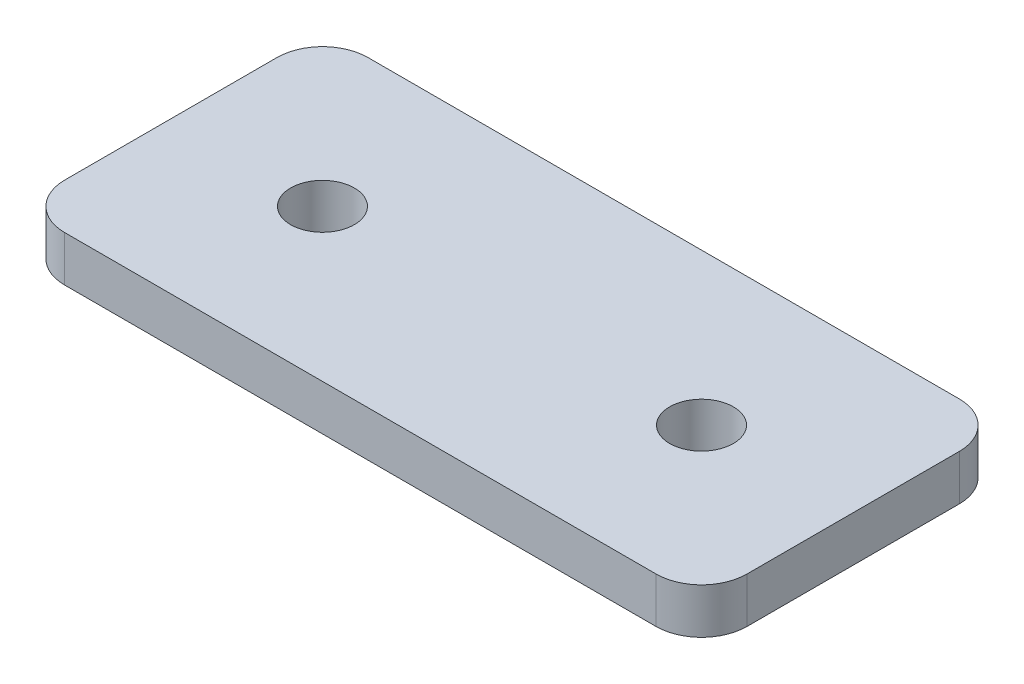
ISO-10303-21;
HEADER;
FILE_DESCRIPTION(('STEP AP214'),'2;1');
FILE_NAME('part.step','',(''),(''),'','','');
FILE_SCHEMA(('AUTOMOTIVE_DESIGN { 1 0 10303 214 1 1 1 1 }'));
ENDSEC;
DATA;
#1=APPLICATION_CONTEXT('core data for automotive mechanical design processes');
#2=APPLICATION_PROTOCOL_DEFINITION('international standard','automotive_design',2000,#1);
#3=PRODUCT_CONTEXT('',#1,'mechanical');
#4=PRODUCT('Part','Part','',(#3));
#5=PRODUCT_RELATED_PRODUCT_CATEGORY('part','',(#4));
#6=PRODUCT_DEFINITION_FORMATION('','',#4);
#7=PRODUCT_DEFINITION_CONTEXT('part definition',#1,'design');
#8=PRODUCT_DEFINITION('design','',#6,#7);
#9=PRODUCT_DEFINITION_SHAPE('','',#8);
#10=(LENGTH_UNIT() NAMED_UNIT(*) SI_UNIT(.MILLI.,.METRE.));
#11=(NAMED_UNIT(*) PLANE_ANGLE_UNIT() SI_UNIT($,.RADIAN.));
#12=(NAMED_UNIT(*) SI_UNIT($,.STERADIAN.) SOLID_ANGLE_UNIT());
#13=UNCERTAINTY_MEASURE_WITH_UNIT(LENGTH_MEASURE(1.E-05),#10,'distance_accuracy_value','');
#14=(GEOMETRIC_REPRESENTATION_CONTEXT(3) GLOBAL_UNCERTAINTY_ASSIGNED_CONTEXT((#13)) GLOBAL_UNIT_ASSIGNED_CONTEXT((#10,
#11,#12)) REPRESENTATION_CONTEXT('',''));
#15=CARTESIAN_POINT('',(0.,0.,0.));
#16=DIRECTION('',(0.,0.,1.));
#17=DIRECTION('',(1.,0.,0.));
#18=AXIS2_PLACEMENT_3D('',#15,#16,#17);
#19=CARTESIAN_POINT('',(0.,3.,0.));
#20=DIRECTION('',(0.,1.,0.));
#21=DIRECTION('',(0.,0.,1.));
#22=AXIS2_PLACEMENT_3D('',#19,#20,#21);
#23=PLANE('',#22);
#24=CARTESIAN_POINT('',(0.,3.,0.));
#25=DIRECTION('',(0.,1.,0.));
#26=DIRECTION('',(0.,0.,1.));
#27=AXIS2_PLACEMENT_3D('',#24,#25,#26);
#28=CIRCLE('',#27,2.1);
#29=CARTESIAN_POINT('',(0.,3.,2.1));
#30=VERTEX_POINT('',#29);
#31=EDGE_CURVE('E170',#30,#30,#28,.T.);
#32=ORIENTED_EDGE('',*,*,#31,.F.);
#33=EDGE_LOOP('',(#32));
#34=FACE_BOUND('',#33,.T.);
#35=DIRECTION('',(0.,0.,1.));
#36=VECTOR('',#35,1.);
#37=CARTESIAN_POINT('',(-10.,3.,-10.));
#38=LINE('',#37,#36);
#39=CARTESIAN_POINT('',(-10.,3.,-7.));
#40=VERTEX_POINT('',#39);
#41=CARTESIAN_POINT('',(-10.,3.,7.));
#42=VERTEX_POINT('',#41);
#43=EDGE_CURVE('E177',#40,#42,#38,.T.);
#44=ORIENTED_EDGE('',*,*,#43,.T.);
#45=CARTESIAN_POINT('',(-7.,3.,7.));
#46=DIRECTION('',(0.,1.,0.));
#47=DIRECTION('',(0.,0.,1.));
#48=AXIS2_PLACEMENT_3D('',#45,#46,#47);
#49=CIRCLE('',#48,3.);
#50=CARTESIAN_POINT('',(-7.,3.,10.));
#51=VERTEX_POINT('',#50);
#52=EDGE_CURVE('E154',#42,#51,#49,.T.);
#53=ORIENTED_EDGE('',*,*,#52,.T.);
#54=DIRECTION('',(1.,0.,0.));
#55=VECTOR('',#54,1.);
#56=CARTESIAN_POINT('',(-10.,3.,10.));
#57=LINE('',#56,#55);
#58=CARTESIAN_POINT('',(32.,3.,10.));
#59=VERTEX_POINT('',#58);
#60=EDGE_CURVE('E125',#51,#59,#57,.T.);
#61=ORIENTED_EDGE('',*,*,#60,.T.);
#62=CARTESIAN_POINT('',(32.,3.,7.));
#63=DIRECTION('',(0.,1.,0.));
#64=DIRECTION('',(0.,0.,1.));
#65=AXIS2_PLACEMENT_3D('',#62,#63,#64);
#66=CIRCLE('',#65,3.);
#67=CARTESIAN_POINT('',(35.,3.,7.));
#68=VERTEX_POINT('',#67);
#69=EDGE_CURVE('E149',#59,#68,#66,.T.);
#70=ORIENTED_EDGE('',*,*,#69,.T.);
#71=DIRECTION('',(0.,0.,-1.));
#72=VECTOR('',#71,1.);
#73=CARTESIAN_POINT('',(35.,3.,-10.));
#74=LINE('',#73,#72);
#75=CARTESIAN_POINT('',(35.,3.,-7.));
#76=VERTEX_POINT('',#75);
#77=EDGE_CURVE('E132',#68,#76,#74,.T.);
#78=ORIENTED_EDGE('',*,*,#77,.T.);
#79=CARTESIAN_POINT('',(32.,3.,-7.));
#80=DIRECTION('',(0.,1.,0.));
#81=DIRECTION('',(0.,0.,1.));
#82=AXIS2_PLACEMENT_3D('',#79,#80,#81);
#83=CIRCLE('',#82,3.);
#84=CARTESIAN_POINT('',(32.,3.,-10.));
#85=VERTEX_POINT('',#84);
#86=EDGE_CURVE('E61',#76,#85,#83,.T.);
#87=ORIENTED_EDGE('',*,*,#86,.T.);
#88=DIRECTION('',(-1.,0.,0.));
#89=VECTOR('',#88,1.);
#90=CARTESIAN_POINT('',(-10.,3.,-10.));
#91=LINE('',#90,#89);
#92=CARTESIAN_POINT('',(-7.,3.,-10.));
#93=VERTEX_POINT('',#92);
#94=EDGE_CURVE('E135',#85,#93,#91,.T.);
#95=ORIENTED_EDGE('',*,*,#94,.T.);
#96=CARTESIAN_POINT('',(-7.,3.,-7.));
#97=DIRECTION('',(0.,1.,0.));
#98=DIRECTION('',(0.,0.,1.));
#99=AXIS2_PLACEMENT_3D('',#96,#97,#98);
#100=CIRCLE('',#99,3.);
#101=EDGE_CURVE('E152',#93,#40,#100,.T.);
#102=ORIENTED_EDGE('',*,*,#101,.T.);
#103=EDGE_LOOP('',(#44,#53,#61,#70,#78,#87,#95,#102));
#104=FACE_BOUND('',#103,.T.);
#105=CARTESIAN_POINT('',(25.,3.,0.));
#106=DIRECTION('',(0.,1.,0.));
#107=DIRECTION('',(0.,0.,1.));
#108=AXIS2_PLACEMENT_3D('',#105,#106,#107);
#109=CIRCLE('',#108,2.1);
#110=CARTESIAN_POINT('',(25.,3.,2.1));
#111=VERTEX_POINT('',#110);
#112=EDGE_CURVE('E182',#111,#111,#109,.T.);
#113=ORIENTED_EDGE('',*,*,#112,.F.);
#114=EDGE_LOOP('',(#113));
#115=FACE_BOUND('',#114,.T.);
#116=ADVANCED_FACE('F39',(#34,#104,#115),#23,.T.);
#117=CARTESIAN_POINT('',(0.,0.,0.));
#118=DIRECTION('',(0.,1.,0.));
#119=DIRECTION('',(0.,0.,1.));
#120=AXIS2_PLACEMENT_3D('',#117,#118,#119);
#121=PLANE('',#120);
#122=DIRECTION('',(1.,0.,0.));
#123=VECTOR('',#122,1.);
#124=CARTESIAN_POINT('',(-10.,0.,10.));
#125=LINE('',#124,#123);
#126=CARTESIAN_POINT('',(-7.,0.,10.));
#127=VERTEX_POINT('',#126);
#128=CARTESIAN_POINT('',(32.,0.,10.));
#129=VERTEX_POINT('',#128);
#130=EDGE_CURVE('E122',#127,#129,#125,.T.);
#131=ORIENTED_EDGE('',*,*,#130,.F.);
#132=CARTESIAN_POINT('',(-7.,0.,7.));
#133=DIRECTION('',(0.,1.,0.));
#134=DIRECTION('',(0.,0.,1.));
#135=AXIS2_PLACEMENT_3D('',#132,#133,#134);
#136=CIRCLE('',#135,3.);
#137=CARTESIAN_POINT('',(-10.,0.,7.));
#138=VERTEX_POINT('',#137);
#139=EDGE_CURVE('E105',#127,#138,#136,.F.);
#140=ORIENTED_EDGE('',*,*,#139,.T.);
#141=DIRECTION('',(0.,0.,1.));
#142=VECTOR('',#141,1.);
#143=CARTESIAN_POINT('',(-10.,0.,-10.));
#144=LINE('',#143,#142);
#145=CARTESIAN_POINT('',(-10.,0.,-7.));
#146=VERTEX_POINT('',#145);
#147=EDGE_CURVE('E133',#146,#138,#144,.T.);
#148=ORIENTED_EDGE('',*,*,#147,.F.);
#149=CARTESIAN_POINT('',(-7.,0.,-7.));
#150=DIRECTION('',(0.,1.,0.));
#151=DIRECTION('',(0.,0.,1.));
#152=AXIS2_PLACEMENT_3D('',#149,#150,#151);
#153=CIRCLE('',#152,3.);
#154=CARTESIAN_POINT('',(-7.,0.,-10.));
#155=VERTEX_POINT('',#154);
#156=EDGE_CURVE('E116',#146,#155,#153,.F.);
#157=ORIENTED_EDGE('',*,*,#156,.T.);
#158=DIRECTION('',(-1.,0.,0.));
#159=VECTOR('',#158,1.);
#160=CARTESIAN_POINT('',(-10.,0.,-10.));
#161=LINE('',#160,#159);
#162=CARTESIAN_POINT('',(32.,0.,-10.));
#163=VERTEX_POINT('',#162);
#164=EDGE_CURVE('E137',#163,#155,#161,.T.);
#165=ORIENTED_EDGE('',*,*,#164,.F.);
#166=CARTESIAN_POINT('',(32.,0.,-7.));
#167=DIRECTION('',(0.,1.,0.));
#168=DIRECTION('',(0.,0.,1.));
#169=AXIS2_PLACEMENT_3D('',#166,#167,#168);
#170=CIRCLE('',#169,3.);
#171=CARTESIAN_POINT('',(35.,0.,-7.));
#172=VERTEX_POINT('',#171);
#173=EDGE_CURVE('E143',#163,#172,#170,.F.);
#174=ORIENTED_EDGE('',*,*,#173,.T.);
#175=DIRECTION('',(0.,0.,-1.));
#176=VECTOR('',#175,1.);
#177=CARTESIAN_POINT('',(35.,0.,-10.));
#178=LINE('',#177,#176);
#179=CARTESIAN_POINT('',(35.,0.,7.));
#180=VERTEX_POINT('',#179);
#181=EDGE_CURVE('E165',#180,#172,#178,.T.);
#182=ORIENTED_EDGE('',*,*,#181,.F.);
#183=CARTESIAN_POINT('',(32.,0.,7.));
#184=DIRECTION('',(0.,1.,0.));
#185=DIRECTION('',(0.,0.,1.));
#186=AXIS2_PLACEMENT_3D('',#183,#184,#185);
#187=CIRCLE('',#186,3.);
#188=EDGE_CURVE('E126',#180,#129,#187,.F.);
#189=ORIENTED_EDGE('',*,*,#188,.T.);
#190=EDGE_LOOP('',(#131,#140,#148,#157,#165,#174,#182,#189));
#191=FACE_BOUND('',#190,.T.);
#192=CARTESIAN_POINT('',(0.,0.,0.));
#193=DIRECTION('',(0.,1.,0.));
#194=DIRECTION('',(0.,0.,1.));
#195=AXIS2_PLACEMENT_3D('',#192,#193,#194);
#196=CIRCLE('',#195,2.1);
#197=CARTESIAN_POINT('',(0.,0.,2.1));
#198=VERTEX_POINT('',#197);
#199=EDGE_CURVE('E173',#198,#198,#196,.T.);
#200=ORIENTED_EDGE('',*,*,#199,.T.);
#201=EDGE_LOOP('',(#200));
#202=FACE_BOUND('',#201,.T.);
#203=CARTESIAN_POINT('',(25.,0.,0.));
#204=DIRECTION('',(0.,1.,0.));
#205=DIRECTION('',(0.,0.,1.));
#206=AXIS2_PLACEMENT_3D('',#203,#204,#205);
#207=CIRCLE('',#206,2.1);
#208=CARTESIAN_POINT('',(25.,0.,2.1));
#209=VERTEX_POINT('',#208);
#210=EDGE_CURVE('E184',#209,#209,#207,.T.);
#211=ORIENTED_EDGE('',*,*,#210,.T.);
#212=EDGE_LOOP('',(#211));
#213=FACE_BOUND('',#212,.T.);
#214=ADVANCED_FACE('F129',(#191,#202,#213),#121,.F.);
#215=CARTESIAN_POINT('',(35.,3.,-10.));
#216=DIRECTION('',(-1.,0.,0.));
#217=DIRECTION('',(0.,0.,1.));
#218=AXIS2_PLACEMENT_3D('',#215,#216,#217);
#219=PLANE('',#218);
#220=ORIENTED_EDGE('',*,*,#181,.T.);
#221=DIRECTION('',(0.,-1.,0.));
#222=VECTOR('',#221,1.);
#223=CARTESIAN_POINT('',(35.,3.,-7.));
#224=LINE('',#223,#222);
#225=EDGE_CURVE('E11',#172,#76,#224,.F.);
#226=ORIENTED_EDGE('',*,*,#225,.T.);
#227=ORIENTED_EDGE('',*,*,#77,.F.);
#228=DIRECTION('',(0.,-1.,0.));
#229=VECTOR('',#228,1.);
#230=CARTESIAN_POINT('',(35.,3.,7.));
#231=LINE('',#230,#229);
#232=EDGE_CURVE('E47',#68,#180,#231,.T.);
#233=ORIENTED_EDGE('',*,*,#232,.T.);
#234=EDGE_LOOP('',(#220,#226,#227,#233));
#235=FACE_BOUND('',#234,.T.);
#236=ADVANCED_FACE('F164',(#235),#219,.F.);
#237=CARTESIAN_POINT('',(-10.,3.,-10.));
#238=DIRECTION('',(0.,0.,1.));
#239=DIRECTION('',(1.,0.,0.));
#240=AXIS2_PLACEMENT_3D('',#237,#238,#239);
#241=PLANE('',#240);
#242=ORIENTED_EDGE('',*,*,#164,.T.);
#243=DIRECTION('',(0.,-1.,0.));
#244=VECTOR('',#243,1.);
#245=CARTESIAN_POINT('',(-7.,3.,-10.));
#246=LINE('',#245,#244);
#247=EDGE_CURVE('E54',#155,#93,#246,.F.);
#248=ORIENTED_EDGE('',*,*,#247,.T.);
#249=ORIENTED_EDGE('',*,*,#94,.F.);
#250=DIRECTION('',(0.,-1.,0.));
#251=VECTOR('',#250,1.);
#252=CARTESIAN_POINT('',(32.,3.,-10.));
#253=LINE('',#252,#251);
#254=EDGE_CURVE('E156',#85,#163,#253,.T.);
#255=ORIENTED_EDGE('',*,*,#254,.T.);
#256=EDGE_LOOP('',(#242,#248,#249,#255));
#257=FACE_BOUND('',#256,.T.);
#258=ADVANCED_FACE('F211',(#257),#241,.F.);
#259=CARTESIAN_POINT('',(-10.,3.,-10.));
#260=DIRECTION('',(1.,0.,0.));
#261=DIRECTION('',(0.,0.,-1.));
#262=AXIS2_PLACEMENT_3D('',#259,#260,#261);
#263=PLANE('',#262);
#264=ORIENTED_EDGE('',*,*,#147,.T.);
#265=DIRECTION('',(0.,-1.,0.));
#266=VECTOR('',#265,1.);
#267=CARTESIAN_POINT('',(-10.,3.,7.));
#268=LINE('',#267,#266);
#269=EDGE_CURVE('E110',#138,#42,#268,.F.);
#270=ORIENTED_EDGE('',*,*,#269,.T.);
#271=ORIENTED_EDGE('',*,*,#43,.F.);
#272=DIRECTION('',(0.,-1.,0.));
#273=VECTOR('',#272,1.);
#274=CARTESIAN_POINT('',(-10.,3.,-7.));
#275=LINE('',#274,#273);
#276=EDGE_CURVE('E115',#40,#146,#275,.T.);
#277=ORIENTED_EDGE('',*,*,#276,.T.);
#278=EDGE_LOOP('',(#264,#270,#271,#277));
#279=FACE_BOUND('',#278,.T.);
#280=ADVANCED_FACE('F208',(#279),#263,.F.);
#281=CARTESIAN_POINT('',(-10.,3.,10.));
#282=DIRECTION('',(0.,0.,-1.));
#283=DIRECTION('',(-1.,0.,0.));
#284=AXIS2_PLACEMENT_3D('',#281,#282,#283);
#285=PLANE('',#284);
#286=ORIENTED_EDGE('',*,*,#60,.F.);
#287=DIRECTION('',(0.,-1.,0.));
#288=VECTOR('',#287,1.);
#289=CARTESIAN_POINT('',(-7.,3.,10.));
#290=LINE('',#289,#288);
#291=EDGE_CURVE('E109',#51,#127,#290,.T.);
#292=ORIENTED_EDGE('',*,*,#291,.T.);
#293=ORIENTED_EDGE('',*,*,#130,.T.);
#294=DIRECTION('',(0.,-1.,0.));
#295=VECTOR('',#294,1.);
#296=CARTESIAN_POINT('',(32.,3.,10.));
#297=LINE('',#296,#295);
#298=EDGE_CURVE('E127',#129,#59,#297,.F.);
#299=ORIENTED_EDGE('',*,*,#298,.T.);
#300=EDGE_LOOP('',(#286,#292,#293,#299));
#301=FACE_BOUND('',#300,.T.);
#302=ADVANCED_FACE('F121',(#301),#285,.F.);
#303=CARTESIAN_POINT('',(0.,3.,0.));
#304=DIRECTION('',(0.,-1.,0.));
#305=DIRECTION('',(0.,0.,-1.));
#306=AXIS2_PLACEMENT_3D('',#303,#304,#305);
#307=CYLINDRICAL_SURFACE('',#306,2.1);
#308=ORIENTED_EDGE('',*,*,#31,.T.);
#309=EDGE_LOOP('',(#308));
#310=FACE_BOUND('',#309,.T.);
#311=ORIENTED_EDGE('',*,*,#199,.F.);
#312=EDGE_LOOP('',(#311));
#313=FACE_BOUND('',#312,.T.);
#314=ADVANCED_FACE('F203',(#310,#313),#307,.F.);
#315=CARTESIAN_POINT('',(25.,3.,0.));
#316=DIRECTION('',(0.,-1.,0.));
#317=DIRECTION('',(0.,0.,-1.));
#318=AXIS2_PLACEMENT_3D('',#315,#316,#317);
#319=CYLINDRICAL_SURFACE('',#318,2.1);
#320=ORIENTED_EDGE('',*,*,#112,.T.);
#321=EDGE_LOOP('',(#320));
#322=FACE_BOUND('',#321,.T.);
#323=ORIENTED_EDGE('',*,*,#210,.F.);
#324=EDGE_LOOP('',(#323));
#325=FACE_BOUND('',#324,.T.);
#326=ADVANCED_FACE('F190',(#322,#325),#319,.F.);
#327=CARTESIAN_POINT('',(-7.,3.,7.));
#328=DIRECTION('',(0.,-1.,0.));
#329=DIRECTION('',(0.,0.,-1.));
#330=AXIS2_PLACEMENT_3D('',#327,#328,#329);
#331=CYLINDRICAL_SURFACE('',#330,3.);
#332=ORIENTED_EDGE('',*,*,#52,.F.);
#333=ORIENTED_EDGE('',*,*,#269,.F.);
#334=ORIENTED_EDGE('',*,*,#139,.F.);
#335=ORIENTED_EDGE('',*,*,#291,.F.);
#336=EDGE_LOOP('',(#332,#333,#334,#335));
#337=FACE_BOUND('',#336,.T.);
#338=ADVANCED_FACE('F108',(#337),#331,.T.);
#339=CARTESIAN_POINT('',(-7.,3.,-7.));
#340=DIRECTION('',(0.,-1.,0.));
#341=DIRECTION('',(0.,0.,-1.));
#342=AXIS2_PLACEMENT_3D('',#339,#340,#341);
#343=CYLINDRICAL_SURFACE('',#342,3.);
#344=ORIENTED_EDGE('',*,*,#101,.F.);
#345=ORIENTED_EDGE('',*,*,#247,.F.);
#346=ORIENTED_EDGE('',*,*,#156,.F.);
#347=ORIENTED_EDGE('',*,*,#276,.F.);
#348=EDGE_LOOP('',(#344,#345,#346,#347));
#349=FACE_BOUND('',#348,.T.);
#350=ADVANCED_FACE('F219',(#349),#343,.T.);
#351=CARTESIAN_POINT('',(32.,3.,-7.));
#352=DIRECTION('',(0.,-1.,0.));
#353=DIRECTION('',(0.,0.,-1.));
#354=AXIS2_PLACEMENT_3D('',#351,#352,#353);
#355=CYLINDRICAL_SURFACE('',#354,3.);
#356=ORIENTED_EDGE('',*,*,#86,.F.);
#357=ORIENTED_EDGE('',*,*,#225,.F.);
#358=ORIENTED_EDGE('',*,*,#173,.F.);
#359=ORIENTED_EDGE('',*,*,#254,.F.);
#360=EDGE_LOOP('',(#356,#357,#358,#359));
#361=FACE_BOUND('',#360,.T.);
#362=ADVANCED_FACE('F221',(#361),#355,.T.);
#363=CARTESIAN_POINT('',(32.,3.,7.));
#364=DIRECTION('',(0.,-1.,0.));
#365=DIRECTION('',(0.,0.,-1.));
#366=AXIS2_PLACEMENT_3D('',#363,#364,#365);
#367=CYLINDRICAL_SURFACE('',#366,3.);
#368=ORIENTED_EDGE('',*,*,#69,.F.);
#369=ORIENTED_EDGE('',*,*,#298,.F.);
#370=ORIENTED_EDGE('',*,*,#188,.F.);
#371=ORIENTED_EDGE('',*,*,#232,.F.);
#372=EDGE_LOOP('',(#368,#369,#370,#371));
#373=FACE_BOUND('',#372,.T.);
#374=ADVANCED_FACE('F41',(#373),#367,.T.);
#375=CLOSED_SHELL('',(#116,#214,#236,#258,#280,#302,#314,#326,#338,#350,#362,#374));
#376=MANIFOLD_SOLID_BREP('B2',#375);
#377=ADVANCED_BREP_SHAPE_REPRESENTATION('',(#18,#376),#14);
#378=SHAPE_DEFINITION_REPRESENTATION(#9,#377);
ENDSEC;
END-ISO-10303-21;
